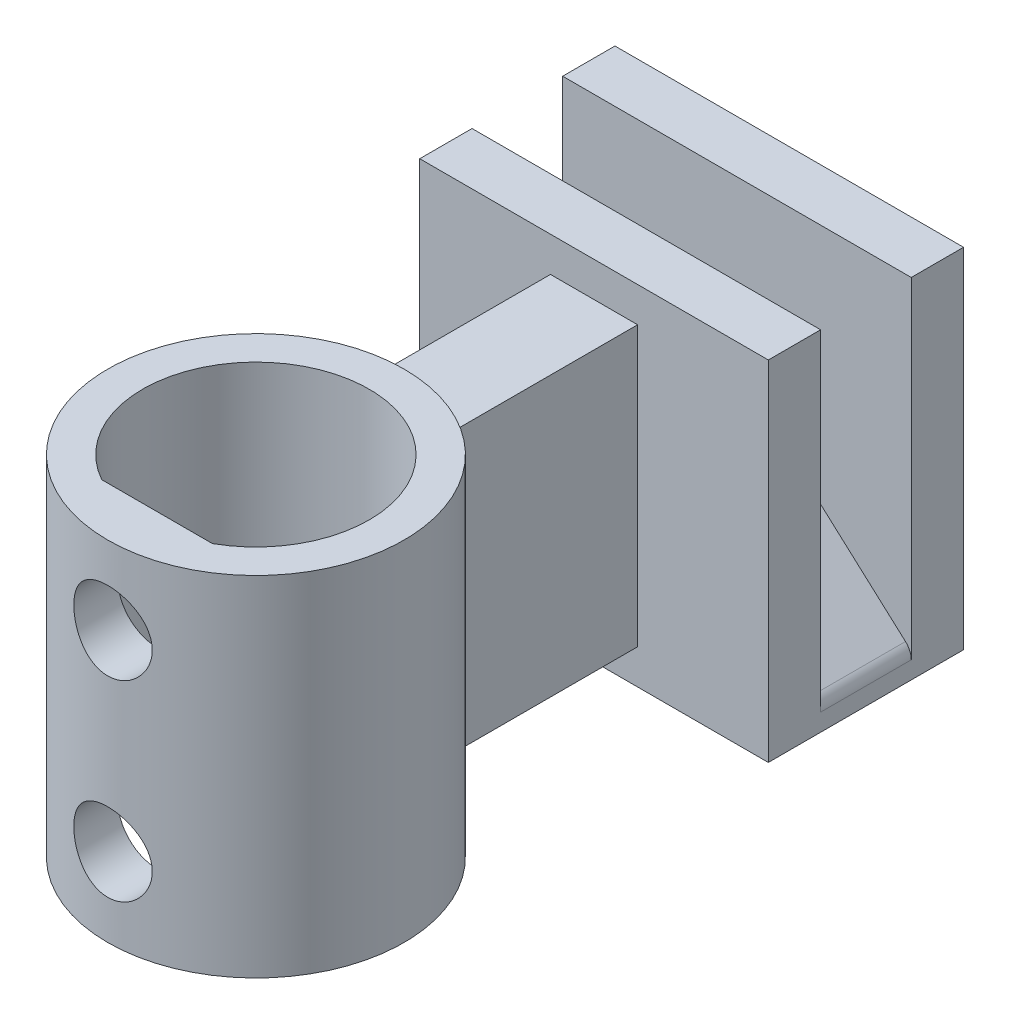
ISO-10303-21;
HEADER;
FILE_DESCRIPTION(('STEP AP214'),'2;1');
FILE_NAME('part.step','',(''),(''),'','','');
FILE_SCHEMA(('AUTOMOTIVE_DESIGN { 1 0 10303 214 1 1 1 1 }'));
ENDSEC;
DATA;
#1=APPLICATION_CONTEXT('core data for automotive mechanical design processes');
#2=APPLICATION_PROTOCOL_DEFINITION('international standard','automotive_design',2000,#1);
#3=PRODUCT_CONTEXT('',#1,'mechanical');
#4=PRODUCT('Part','Part','',(#3));
#5=PRODUCT_RELATED_PRODUCT_CATEGORY('part','',(#4));
#6=PRODUCT_DEFINITION_FORMATION('','',#4);
#7=PRODUCT_DEFINITION_CONTEXT('part definition',#1,'design');
#8=PRODUCT_DEFINITION('design','',#6,#7);
#9=PRODUCT_DEFINITION_SHAPE('','',#8);
#10=(LENGTH_UNIT() NAMED_UNIT(*) SI_UNIT(.MILLI.,.METRE.));
#11=(NAMED_UNIT(*) PLANE_ANGLE_UNIT() SI_UNIT($,.RADIAN.));
#12=(NAMED_UNIT(*) SI_UNIT($,.STERADIAN.) SOLID_ANGLE_UNIT());
#13=UNCERTAINTY_MEASURE_WITH_UNIT(LENGTH_MEASURE(1.E-05),#10,'distance_accuracy_value','');
#14=(GEOMETRIC_REPRESENTATION_CONTEXT(3) GLOBAL_UNCERTAINTY_ASSIGNED_CONTEXT((#13)) GLOBAL_UNIT_ASSIGNED_CONTEXT((#10,
#11,#12)) REPRESENTATION_CONTEXT('',''));
#15=CARTESIAN_POINT('',(0.,0.,0.));
#16=DIRECTION('',(0.,0.,1.));
#17=DIRECTION('',(1.,0.,0.));
#18=AXIS2_PLACEMENT_3D('',#15,#16,#17);
#19=CARTESIAN_POINT('',(0.,39.0416305603426,25.));
#20=DIRECTION('',(0.,-1.,0.));
#21=DIRECTION('',(0.,0.,-1.));
#22=AXIS2_PLACEMENT_3D('',#19,#20,#21);
#23=CYLINDRICAL_SURFACE('',#22,8.5);
#24=CARTESIAN_POINT('',(0.,15.,25.));
#25=DIRECTION('',(0.,-1.,0.));
#26=DIRECTION('',(0.,0.,-1.));
#27=AXIS2_PLACEMENT_3D('',#24,#25,#26);
#28=CIRCLE('',#27,8.5);
#29=CARTESIAN_POINT('',(0.,15.,16.5));
#30=VERTEX_POINT('',#29);
#31=EDGE_CURVE('E188',#30,#30,#28,.T.);
#32=ORIENTED_EDGE('',*,*,#31,.T.);
#33=EDGE_LOOP('',(#32));
#34=FACE_BOUND('',#33,.T.);
#35=CARTESIAN_POINT('',(0.,-5.,25.));
#36=DIRECTION('',(0.,1.,0.));
#37=DIRECTION('',(0.,0.,1.));
#38=AXIS2_PLACEMENT_3D('',#35,#36,#37);
#39=CIRCLE('',#38,8.5);
#40=CARTESIAN_POINT('',(0.,-5.,33.5));
#41=VERTEX_POINT('',#40);
#42=EDGE_CURVE('E194',#41,#41,#39,.F.);
#43=ORIENTED_EDGE('',*,*,#42,.F.);
#44=EDGE_LOOP('',(#43));
#45=FACE_BOUND('',#44,.T.);
#46=CARTESIAN_POINT('',(0.,-3.,25.));
#47=DIRECTION('',(0.,1.,0.));
#48=DIRECTION('',(0.,0.,1.));
#49=AXIS2_PLACEMENT_3D('',#46,#47,#48);
#50=CIRCLE('',#49,8.5);
#51=CARTESIAN_POINT('',(-2.5,-3.,16.875961595364));
#52=VERTEX_POINT('',#51);
#53=CARTESIAN_POINT('',(2.5,-3.,16.875961595364));
#54=VERTEX_POINT('',#53);
#55=EDGE_CURVE('E228',#52,#54,#50,.F.);
#56=ORIENTED_EDGE('',*,*,#55,.T.);
#57=DIRECTION('',(0.,-1.,0.));
#58=VECTOR('',#57,1.);
#59=CARTESIAN_POINT('',(2.5,39.0416305603426,16.875961595364));
#60=LINE('',#59,#58);
#61=CARTESIAN_POINT('',(2.5,13.,16.875961595364));
#62=VERTEX_POINT('',#61);
#63=EDGE_CURVE('E213',#54,#62,#60,.F.);
#64=ORIENTED_EDGE('',*,*,#63,.T.);
#65=CARTESIAN_POINT('',(0.,13.,25.));
#66=DIRECTION('',(0.,-1.,0.));
#67=DIRECTION('',(0.,0.,-1.));
#68=AXIS2_PLACEMENT_3D('',#65,#66,#67);
#69=CIRCLE('',#68,8.5);
#70=CARTESIAN_POINT('',(-2.5,13.,16.875961595364));
#71=VERTEX_POINT('',#70);
#72=EDGE_CURVE('E235',#62,#71,#69,.F.);
#73=ORIENTED_EDGE('',*,*,#72,.T.);
#74=DIRECTION('',(0.,-1.,0.));
#75=VECTOR('',#74,1.);
#76=CARTESIAN_POINT('',(-2.5,39.0416305603426,16.875961595364));
#77=LINE('',#76,#75);
#78=EDGE_CURVE('E232',#71,#52,#77,.T.);
#79=ORIENTED_EDGE('',*,*,#78,.T.);
#80=EDGE_LOOP('',(#56,#64,#73,#79));
#81=FACE_BOUND('',#80,.T.);
#82=CARTESIAN_POINT('',(-2.25,10.5,33.1967981553775));
#83=CARTESIAN_POINT('',(-2.24999694180408,10.6239840002776,33.1968003362435));
#84=CARTESIAN_POINT('',(-2.23971706610501,10.7480005412109,33.1996419584915));
#85=CARTESIAN_POINT('',(-2.198945615888,10.9924544608563,33.2106680196964));
#86=CARTESIAN_POINT('',(-2.16844370713168,11.112889976629,33.2188551904021));
#87=CARTESIAN_POINT('',(-2.0882990785985,11.3466102401079,33.2395815791112));
#88=CARTESIAN_POINT('',(-2.03868300476042,11.459904688051,33.2521147362105));
#89=CARTESIAN_POINT('',(-1.92180166354043,11.6765786826062,33.2801132198881));
#90=CARTESIAN_POINT('',(-1.85453509902009,11.7799574997535,33.2955787619447));
#91=CARTESIAN_POINT('',(-1.70248951742595,11.9764139017784,33.3281265446091));
#92=CARTESIAN_POINT('',(-1.61735395744878,12.0692109081865,33.3452371126252));
#93=CARTESIAN_POINT('',(-1.4327540142738,12.2393902103004,33.3789023677977));
#94=CARTESIAN_POINT('',(-1.33328816547564,12.3167709274061,33.3954569978831));
#95=CARTESIAN_POINT('',(-1.12090838569079,12.4550884366435,33.4264608929721));
#96=CARTESIAN_POINT('',(-1.00780712819347,12.5157466883929,33.4408728427373));
#97=CARTESIAN_POINT('',(-0.772566710508234,12.6170815196129,33.4656427357432));
#98=CARTESIAN_POINT('',(-0.650429055025734,12.6577614172222,33.4760013521304));
#99=CARTESIAN_POINT('',(-0.403511110172187,12.7170778425828,33.4912971460741));
#100=CARTESIAN_POINT('',(-0.278852839843893,12.7361915561904,33.4963515042717));
#101=CARTESIAN_POINT('',(-0.0280034780646866,12.7533339423421,33.5008788349257));
#102=CARTESIAN_POINT('',(0.0981873570184365,12.7513660941808,33.5003527283806));
#103=CARTESIAN_POINT('',(0.34519977639906,12.7267381177659,33.4938644304373));
#104=CARTESIAN_POINT('',(0.466076857336715,12.7045934898765,33.4880376721779));
#105=CARTESIAN_POINT('',(0.702334013138001,12.6410728615727,33.4717623278363));
#106=CARTESIAN_POINT('',(0.817713776487286,12.5996957727456,33.4613134801802));
#107=CARTESIAN_POINT('',(1.04102215095086,12.4984870248307,33.4367663576623));
#108=CARTESIAN_POINT('',(1.14886634833951,12.4384779194592,33.4226332115479));
#109=CARTESIAN_POINT('',(1.3531303740591,12.301844580475,33.3922415251126));
#110=CARTESIAN_POINT('',(1.44954799839656,12.2252171495074,33.375982576028));
#111=CARTESIAN_POINT('',(1.63129857081783,12.0547825542084,33.342521924539));
#112=CARTESIAN_POINT('',(1.71620777876131,11.9605256731685,33.3253065822884));
#113=CARTESIAN_POINT('',(1.86911637013184,11.7589321307718,33.2923181202052));
#114=CARTESIAN_POINT('',(1.93711475347608,11.6515946964081,33.2765450857034));
#115=CARTESIAN_POINT('',(2.05458778503724,11.4259787352489,33.2481731019722));
#116=CARTESIAN_POINT('',(2.10394886477225,11.3076384369629,33.2355937612802));
#117=CARTESIAN_POINT('',(2.18193716023719,11.0639230764637,33.2152779792318));
#118=CARTESIAN_POINT('',(2.21056943128527,10.9385497375025,33.207540357145));
#119=CARTESIAN_POINT('',(2.24556016825425,10.6882860893502,33.1980351929453));
#120=CARTESIAN_POINT('',(2.25255005779307,10.5634903897575,33.1960984643835));
#121=CARTESIAN_POINT('',(2.24579596911986,10.3145136151024,33.1979517680045));
#122=CARTESIAN_POINT('',(2.23205416085442,10.19033247708,33.2017412008412));
#123=CARTESIAN_POINT('',(2.18478304951454,9.94853203437677,33.2144565867633));
#124=CARTESIAN_POINT('',(2.15163187005439,9.83083314067768,33.2232843058655));
#125=CARTESIAN_POINT('',(2.06690749717098,9.60266578735862,33.2449859622244));
#126=CARTESIAN_POINT('',(2.0153319242454,9.49219826384843,33.2578604220901));
#127=CARTESIAN_POINT('',(1.89393612864426,9.27898360406455,33.2865532711528));
#128=CARTESIAN_POINT('',(1.82374430356199,9.17645600255329,33.3024294781708));
#129=CARTESIAN_POINT('',(1.66757023068808,8.98440278488017,33.3352002454647));
#130=CARTESIAN_POINT('',(1.58158505971235,8.89487958119961,33.3520949938724));
#131=CARTESIAN_POINT('',(1.39334723217788,8.72876291555247,33.3855805923336));
#132=CARTESIAN_POINT('',(1.29070161878611,8.65260935870141,33.4021491503459));
#133=CARTESIAN_POINT('',(1.07371678547403,8.51861464758931,33.4326221761272));
#134=CARTESIAN_POINT('',(0.959378187911347,8.46077251937521,33.4465267855714));
#135=CARTESIAN_POINT('',(0.723057226149525,8.36557056201773,33.470015772103));
#136=CARTESIAN_POINT('',(0.60113959611423,8.32805833034544,33.4796321961789));
#137=CARTESIAN_POINT('',(0.352439036803731,8.2741367860407,33.4936022569498));
#138=CARTESIAN_POINT('',(0.225657174963255,8.25772287044393,33.4979570415506));
#139=CARTESIAN_POINT('',(-0.0250604722587875,8.24674873433714,33.5008598374346));
#140=CARTESIAN_POINT('',(-0.148966409472797,8.2515427679478,33.499579436696));
#141=CARTESIAN_POINT('',(-0.394141954180563,8.28135153536109,33.4917428575153));
#142=CARTESIAN_POINT('',(-0.515411657917084,8.30636552970252,33.4851868720061));
#143=CARTESIAN_POINT('',(-0.751107699159933,8.37554121781611,33.4675689262979));
#144=CARTESIAN_POINT('',(-0.865574416324465,8.41957360028427,33.4565374265752));
#145=CARTESIAN_POINT('',(-1.08556048681217,8.5254205314973,33.4311229382255));
#146=CARTESIAN_POINT('',(-1.19107859706731,8.58723754551755,33.4167394850088));
#147=CARTESIAN_POINT('',(-1.39318530515942,8.72879850578497,33.3856885458129));
#148=CARTESIAN_POINT('',(-1.48946543719377,8.80897181418192,33.3689708718519));
#149=CARTESIAN_POINT('',(-1.66742398064291,8.98415288335479,33.3353414220771));
#150=CARTESIAN_POINT('',(-1.74909856114583,9.07916452389294,33.3184295965731));
#151=CARTESIAN_POINT('',(-1.8972708258445,9.2837921479421,33.285906991571));
#152=CARTESIAN_POINT('',(-1.96340296292341,9.39367904330234,33.2703321637851));
#153=CARTESIAN_POINT('',(-2.07615948784757,9.62341015894324,33.2427515934587));
#154=CARTESIAN_POINT('',(-2.12279681152532,9.74324771294936,33.2307434857482));
#155=CARTESIAN_POINT('',(-2.18903256232817,9.96889360228065,33.2133487458215));
#156=CARTESIAN_POINT('',(-2.21184214669942,10.0737109686333,33.2071920574266));
#157=CARTESIAN_POINT('',(-2.24232635318084,10.2856776239988,33.1989160421293));
#158=CARTESIAN_POINT('',(-2.25000264354342,10.3928266546586,33.1967962702092));
#159=CARTESIAN_POINT('',(-2.25,10.5,33.1967981553775));
#160=B_SPLINE_CURVE_WITH_KNOTS('',3,(#82,#83,#84,#85,#86,#87,#88,#89,#90,#91,#92,#93,#94,#95,
#96,#97,#98,#99,#100,#101,#102,#103,#104,#105,#106,#107,#108,#109,#110,#111,#112,#113,#114,#115,
#116,#117,#118,#119,#120,#121,#122,#123,#124,#125,#126,#127,#128,#129,#130,#131,#132,#133,#134,
#135,#136,#137,#138,#139,#140,#141,#142,#143,#144,#145,#146,#147,#148,#149,#150,#151,#152,#153,
#154,#155,#156,#157,#158,#159),.UNSPECIFIED.,.T.,.F.,(4,2,2,2,2,2,2,2,2,2,2,2,2,2,2,2,2,2,2,2,2,
2,2,2,2,2,2,2,2,2,2,2,2,2,2,2,2,2,4),(0.,0.37155797163531,0.743305970231715,1.11453760110695,
1.48579652152091,1.86532086241599,2.24488404596034,2.63043245150024,3.01591680090743,
3.39269333716487,3.76940769129443,4.13675920765004,4.50413151587257,4.87511584526133,
5.24617161521628,5.62845622010334,6.01076342740043,6.3953640456007,6.77987083621654,
7.15304843134813,7.52618696941451,7.89228731518204,8.25843495975225,8.63252754907452,
9.00668944894658,9.39148781847044,9.77626571779774,10.1581177737158,10.539886507824,
10.9101123860205,11.2803247253535,11.6480585642679,12.0158434024024,12.3933170752266,
12.7708896114263,13.156610044578,13.5420741241071,13.8632889681006,14.1844684002793),.UNSPECIFIED.);
#161=CARTESIAN_POINT('',(-2.25,10.5,33.1967981553775));
#162=VERTEX_POINT('',#161);
#163=EDGE_CURVE('E200',#162,#162,#160,.T.);
#164=ORIENTED_EDGE('',*,*,#163,.T.);
#165=EDGE_LOOP('',(#164));
#166=FACE_BOUND('',#165,.T.);
#167=CARTESIAN_POINT('',(-2.25,-0.500000000000002,33.1967981553775));
#168=CARTESIAN_POINT('',(-2.24999694180408,-0.376015999722374,33.1968003362435));
#169=CARTESIAN_POINT('',(-2.23971706610501,-0.251999458789078,33.1996419584915));
#170=CARTESIAN_POINT('',(-2.198945615888,-0.00754553914369019,33.2106680196964));
#171=CARTESIAN_POINT('',(-2.16844370713168,0.112889976628972,33.2188551904021));
#172=CARTESIAN_POINT('',(-2.0882990785985,0.346610240107896,33.2395815791112));
#173=CARTESIAN_POINT('',(-2.03868300476042,0.459904688051024,33.2521147362105));
#174=CARTESIAN_POINT('',(-1.92180166354043,0.676578682606188,33.2801132198881));
#175=CARTESIAN_POINT('',(-1.85453509902009,0.779957499753548,33.2955787619447));
#176=CARTESIAN_POINT('',(-1.70248951742595,0.976413901778359,33.3281265446091));
#177=CARTESIAN_POINT('',(-1.61735395744878,1.06921090818649,33.3452371126252));
#178=CARTESIAN_POINT('',(-1.4327540142738,1.23939021030035,33.3789023677977));
#179=CARTESIAN_POINT('',(-1.33328816547564,1.31677092740614,33.3954569978831));
#180=CARTESIAN_POINT('',(-1.12090838569079,1.45508843664353,33.426460892972));
#181=CARTESIAN_POINT('',(-1.00780712819347,1.51574668839292,33.4408728427372));
#182=CARTESIAN_POINT('',(-0.772566710508234,1.6170815196129,33.4656427357431));
#183=CARTESIAN_POINT('',(-0.650429055025735,1.65776141722221,33.4760013521304));
#184=CARTESIAN_POINT('',(-0.403511110172187,1.71707784258281,33.4912971460741));
#185=CARTESIAN_POINT('',(-0.278852839843893,1.73619155619042,33.4963515042717));
#186=CARTESIAN_POINT('',(-0.0280034780646869,1.75333394234214,33.5008788349257));
#187=CARTESIAN_POINT('',(0.0981873570184361,1.75136609418084,33.5003527283806));
#188=CARTESIAN_POINT('',(0.34519977639906,1.72673811776592,33.4938644304373));
#189=CARTESIAN_POINT('',(0.466076857336715,1.70459348987647,33.4880376721779));
#190=CARTESIAN_POINT('',(0.702334013138001,1.6410728615727,33.4717623278363));
#191=CARTESIAN_POINT('',(0.817713776487285,1.59969577274563,33.4613134801802));
#192=CARTESIAN_POINT('',(1.04102215095086,1.49848702483075,33.4367663576623));
#193=CARTESIAN_POINT('',(1.14886634833951,1.43847791945919,33.4226332115479));
#194=CARTESIAN_POINT('',(1.3531303740591,1.30184458047502,33.3922415251126));
#195=CARTESIAN_POINT('',(1.44954799839656,1.22521714950741,33.375982576028));
#196=CARTESIAN_POINT('',(1.63129857081783,1.05478255420836,33.342521924539));
#197=CARTESIAN_POINT('',(1.71620777876131,0.960525673168511,33.3253065822884));
#198=CARTESIAN_POINT('',(1.86911637013183,0.758932130771777,33.2923181202052));
#199=CARTESIAN_POINT('',(1.93711475347608,0.651594696408099,33.2765450857034));
#200=CARTESIAN_POINT('',(2.05458778503724,0.425978735248875,33.2481731019722));
#201=CARTESIAN_POINT('',(2.10394886477225,0.307638436962872,33.2355937612802));
#202=CARTESIAN_POINT('',(2.18193716023719,0.0639230764637289,33.2152779792318));
#203=CARTESIAN_POINT('',(2.21056943128527,-0.0614502624975041,33.207540357145));
#204=CARTESIAN_POINT('',(2.24556016825425,-0.311713910649751,33.1980351929453));
#205=CARTESIAN_POINT('',(2.25255005779307,-0.436509610242537,33.1960984643835));
#206=CARTESIAN_POINT('',(2.24579596911986,-0.685486384897617,33.1979517680045));
#207=CARTESIAN_POINT('',(2.23205416085442,-0.809667522920008,33.2017412008412));
#208=CARTESIAN_POINT('',(2.18478304951454,-1.05146796562323,33.2144565867633));
#209=CARTESIAN_POINT('',(2.15163187005439,-1.16916685932232,33.2232843058654));
#210=CARTESIAN_POINT('',(2.06690749717098,-1.39733421264138,33.2449859622244));
#211=CARTESIAN_POINT('',(2.0153319242454,-1.50780173615157,33.2578604220901));
#212=CARTESIAN_POINT('',(1.89393612864426,-1.72101639593545,33.2865532711528));
#213=CARTESIAN_POINT('',(1.82374430356199,-1.82354399744671,33.3024294781708));
#214=CARTESIAN_POINT('',(1.66757023068808,-2.01559721511983,33.3352002454647));
#215=CARTESIAN_POINT('',(1.58158505971235,-2.10512041880039,33.3520949938724));
#216=CARTESIAN_POINT('',(1.39334723217788,-2.27123708444753,33.3855805923336));
#217=CARTESIAN_POINT('',(1.29070161878611,-2.34739064129859,33.4021491503459));
#218=CARTESIAN_POINT('',(1.07371678547403,-2.48138535241069,33.4326221761272));
#219=CARTESIAN_POINT('',(0.959378187911347,-2.53922748062479,33.4465267855714));
#220=CARTESIAN_POINT('',(0.723057226149525,-2.63442943798227,33.470015772103));
#221=CARTESIAN_POINT('',(0.60113959611423,-2.67194166965456,33.4796321961789));
#222=CARTESIAN_POINT('',(0.352439036803731,-2.7258632139593,33.4936022569498));
#223=CARTESIAN_POINT('',(0.225657174963256,-2.74227712955607,33.4979570415506));
#224=CARTESIAN_POINT('',(-0.0250604722587871,-2.75325126566286,33.5008598374346));
#225=CARTESIAN_POINT('',(-0.148966409472797,-2.7484572320522,33.499579436696));
#226=CARTESIAN_POINT('',(-0.394141954180563,-2.71864846463891,33.4917428575153));
#227=CARTESIAN_POINT('',(-0.515411657917083,-2.69363447029748,33.4851868720061));
#228=CARTESIAN_POINT('',(-0.751107699159933,-2.62445878218389,33.4675689262979));
#229=CARTESIAN_POINT('',(-0.865574416324465,-2.58042639971573,33.4565374265752));
#230=CARTESIAN_POINT('',(-1.08556048681217,-2.4745794685027,33.4311229382255));
#231=CARTESIAN_POINT('',(-1.19107859706731,-2.41276245448245,33.4167394850088));
#232=CARTESIAN_POINT('',(-1.39318530515942,-2.27120149421503,33.3856885458129));
#233=CARTESIAN_POINT('',(-1.48946543719377,-2.19102818581808,33.3689708718519));
#234=CARTESIAN_POINT('',(-1.66742398064291,-2.01584711664521,33.3353414220771));
#235=CARTESIAN_POINT('',(-1.74909856114582,-1.92083547610706,33.3184295965731));
#236=CARTESIAN_POINT('',(-1.8972708258445,-1.7162078520579,33.285906991571));
#237=CARTESIAN_POINT('',(-1.96340296292341,-1.60632095669767,33.2703321637851));
#238=CARTESIAN_POINT('',(-2.07615948784757,-1.37658984105676,33.2427515934587));
#239=CARTESIAN_POINT('',(-2.12279681152532,-1.25675228705065,33.2307434857482));
#240=CARTESIAN_POINT('',(-2.18903256232817,-1.03110639771935,33.2133487458215));
#241=CARTESIAN_POINT('',(-2.21184214669942,-0.92628903136672,33.2071920574266));
#242=CARTESIAN_POINT('',(-2.24232635318084,-0.714322376001232,33.1989160421293));
#243=CARTESIAN_POINT('',(-2.25000264354342,-0.607173345341352,33.1967962702092));
#244=CARTESIAN_POINT('',(-2.25,-0.500000000000002,33.1967981553775));
#245=B_SPLINE_CURVE_WITH_KNOTS('',3,(#167,#168,#169,#170,#171,#172,#173,#174,#175,#176,#177,
#178,#179,#180,#181,#182,#183,#184,#185,#186,#187,#188,#189,#190,#191,#192,#193,#194,#195,#196,
#197,#198,#199,#200,#201,#202,#203,#204,#205,#206,#207,#208,#209,#210,#211,#212,#213,#214,#215,
#216,#217,#218,#219,#220,#221,#222,#223,#224,#225,#226,#227,#228,#229,#230,#231,#232,#233,#234,
#235,#236,#237,#238,#239,#240,#241,#242,#243,#244),.UNSPECIFIED.,.T.,.F.,(4,2,2,2,2,2,2,2,2,2,2,
2,2,2,2,2,2,2,2,2,2,2,2,2,2,2,2,2,2,2,2,2,2,2,2,2,2,2,4),(0.,0.371557971635309,
0.743305970231715,1.11453760110695,1.48579652152091,1.86532086241599,2.24488404596033,
2.63043245150024,3.01591680090743,3.39269333716487,3.76940769129443,4.13675920765004,
4.50413151587256,4.87511584526133,5.24617161521628,5.62845622010334,6.01076342740043,
6.3953640456007,6.77987083621654,7.15304843134812,7.5261869694145,7.89228731518204,
8.25843495975225,8.63252754907452,9.00668944894658,9.39148781847044,9.77626571779773,
10.1581177737158,10.539886507824,10.9101123860205,11.2803247253535,11.6480585642679,
12.0158434024024,12.3933170752266,12.7708896114263,13.156610044578,13.5420741241071,
13.8632889681006,14.1844684002793),.UNSPECIFIED.);
#246=CARTESIAN_POINT('',(-2.25,-0.500000000000002,33.1967981553775));
#247=VERTEX_POINT('',#246);
#248=EDGE_CURVE('E618',#247,#247,#245,.T.);
#249=ORIENTED_EDGE('',*,*,#248,.T.);
#250=EDGE_LOOP('',(#249));
#251=FACE_BOUND('',#250,.T.);
#252=ADVANCED_FACE('F37',(#34,#45,#81,#166,#251),#23,.T.);
#253=CARTESIAN_POINT('',(0.,0.,5.6));
#254=DIRECTION('',(0.,0.,1.));
#255=DIRECTION('',(1.,0.,0.));
#256=AXIS2_PLACEMENT_3D('',#253,#254,#255);
#257=PLANE('',#256);
#258=DIRECTION('',(0.,1.,0.));
#259=VECTOR('',#258,1.);
#260=CARTESIAN_POINT('',(10.,15.,5.6));
#261=LINE('',#260,#259);
#262=CARTESIAN_POINT('',(10.,-5.,5.6));
#263=VERTEX_POINT('',#262);
#264=CARTESIAN_POINT('',(10.,15.,5.6));
#265=VERTEX_POINT('',#264);
#266=EDGE_CURVE('E265',#263,#265,#261,.T.);
#267=ORIENTED_EDGE('',*,*,#266,.T.);
#268=DIRECTION('',(-1.,0.,0.));
#269=VECTOR('',#268,1.);
#270=CARTESIAN_POINT('',(-10.,15.,5.6));
#271=LINE('',#270,#269);
#272=CARTESIAN_POINT('',(-10.,15.,5.6));
#273=VERTEX_POINT('',#272);
#274=EDGE_CURVE('E268',#265,#273,#271,.T.);
#275=ORIENTED_EDGE('',*,*,#274,.T.);
#276=DIRECTION('',(0.,-1.,0.));
#277=VECTOR('',#276,1.);
#278=CARTESIAN_POINT('',(-10.,15.,5.6));
#279=LINE('',#278,#277);
#280=CARTESIAN_POINT('',(-10.,-5.,5.6));
#281=VERTEX_POINT('',#280);
#282=EDGE_CURVE('E271',#273,#281,#279,.T.);
#283=ORIENTED_EDGE('',*,*,#282,.T.);
#284=DIRECTION('',(1.,0.,0.));
#285=VECTOR('',#284,1.);
#286=CARTESIAN_POINT('',(-10.,-5.,5.6));
#287=LINE('',#286,#285);
#288=EDGE_CURVE('E274',#281,#263,#287,.T.);
#289=ORIENTED_EDGE('',*,*,#288,.T.);
#290=EDGE_LOOP('',(#267,#275,#283,#289));
#291=FACE_BOUND('',#290,.T.);
#292=DIRECTION('',(-1.,0.,0.));
#293=VECTOR('',#292,1.);
#294=CARTESIAN_POINT('',(-2.5,13.,5.6));
#295=LINE('',#294,#293);
#296=CARTESIAN_POINT('',(2.5,13.,5.6));
#297=VERTEX_POINT('',#296);
#298=CARTESIAN_POINT('',(-2.5,13.,5.6));
#299=VERTEX_POINT('',#298);
#300=EDGE_CURVE('E217',#297,#299,#295,.T.);
#301=ORIENTED_EDGE('',*,*,#300,.F.);
#302=DIRECTION('',(0.,1.,0.));
#303=VECTOR('',#302,1.);
#304=CARTESIAN_POINT('',(2.5,13.,5.6));
#305=LINE('',#304,#303);
#306=CARTESIAN_POINT('',(2.5,-3.,5.6));
#307=VERTEX_POINT('',#306);
#308=EDGE_CURVE('E221',#307,#297,#305,.T.);
#309=ORIENTED_EDGE('',*,*,#308,.F.);
#310=DIRECTION('',(1.,0.,0.));
#311=VECTOR('',#310,1.);
#312=CARTESIAN_POINT('',(-2.5,-3.,5.6));
#313=LINE('',#312,#311);
#314=CARTESIAN_POINT('',(-2.5,-3.,5.6));
#315=VERTEX_POINT('',#314);
#316=EDGE_CURVE('E210',#315,#307,#313,.T.);
#317=ORIENTED_EDGE('',*,*,#316,.F.);
#318=DIRECTION('',(0.,-1.,0.));
#319=VECTOR('',#318,1.);
#320=CARTESIAN_POINT('',(-2.5,13.,5.6));
#321=LINE('',#320,#319);
#322=EDGE_CURVE('E54',#299,#315,#321,.T.);
#323=ORIENTED_EDGE('',*,*,#322,.F.);
#324=EDGE_LOOP('',(#301,#309,#317,#323));
#325=FACE_BOUND('',#324,.T.);
#326=ADVANCED_FACE('F398',(#291,#325),#257,.T.);
#327=CARTESIAN_POINT('',(10.,-5.,2.6));
#328=DIRECTION('',(-1.,0.,0.));
#329=DIRECTION('',(0.,0.,1.));
#330=AXIS2_PLACEMENT_3D('',#327,#328,#329);
#331=PLANE('',#330);
#332=DIRECTION('',(0.,0.,-1.));
#333=VECTOR('',#332,1.);
#334=CARTESIAN_POINT('',(10.,-5.,2.6));
#335=LINE('',#334,#333);
#336=CARTESIAN_POINT('',(10.,-5.,-5.6));
#337=VERTEX_POINT('',#336);
#338=EDGE_CURVE('E292',#263,#337,#335,.T.);
#339=ORIENTED_EDGE('',*,*,#338,.T.);
#340=DIRECTION('',(0.,1.,0.));
#341=VECTOR('',#340,1.);
#342=CARTESIAN_POINT('',(10.,15.,-5.6));
#343=LINE('',#342,#341);
#344=CARTESIAN_POINT('',(10.,15.,-5.6));
#345=VERTEX_POINT('',#344);
#346=EDGE_CURVE('E240',#337,#345,#343,.T.);
#347=ORIENTED_EDGE('',*,*,#346,.T.);
#348=DIRECTION('',(0.,0.,1.));
#349=VECTOR('',#348,1.);
#350=CARTESIAN_POINT('',(10.,15.,-5.6));
#351=LINE('',#350,#349);
#352=CARTESIAN_POINT('',(10.,15.,-2.6));
#353=VERTEX_POINT('',#352);
#354=EDGE_CURVE('E253',#345,#353,#351,.T.);
#355=ORIENTED_EDGE('',*,*,#354,.T.);
#356=DIRECTION('',(0.,1.,0.));
#357=VECTOR('',#356,1.);
#358=CARTESIAN_POINT('',(10.,15.,-2.6));
#359=LINE('',#358,#357);
#360=CARTESIAN_POINT('',(10.,-3.99906710613802,-2.6));
#361=VERTEX_POINT('',#360);
#362=EDGE_CURVE('E231',#361,#353,#359,.T.);
#363=ORIENTED_EDGE('',*,*,#362,.F.);
#364=DIRECTION('',(0.,0.,-1.));
#365=VECTOR('',#364,1.);
#366=CARTESIAN_POINT('',(10.,-3.99906710613802,2.6));
#367=LINE('',#366,#365);
#368=CARTESIAN_POINT('',(10.,-3.99906710613802,2.6));
#369=VERTEX_POINT('',#368);
#370=EDGE_CURVE('E338',#361,#369,#367,.F.);
#371=ORIENTED_EDGE('',*,*,#370,.T.);
#372=DIRECTION('',(0.,1.,0.));
#373=VECTOR('',#372,1.);
#374=CARTESIAN_POINT('',(10.,15.,2.6));
#375=LINE('',#374,#373);
#376=CARTESIAN_POINT('',(10.,15.,2.6));
#377=VERTEX_POINT('',#376);
#378=EDGE_CURVE('E264',#369,#377,#375,.T.);
#379=ORIENTED_EDGE('',*,*,#378,.T.);
#380=DIRECTION('',(0.,0.,-1.));
#381=VECTOR('',#380,1.);
#382=CARTESIAN_POINT('',(10.,15.,5.6));
#383=LINE('',#382,#381);
#384=EDGE_CURVE('E285',#265,#377,#383,.T.);
#385=ORIENTED_EDGE('',*,*,#384,.F.);
#386=ORIENTED_EDGE('',*,*,#266,.F.);
#387=EDGE_LOOP('',(#339,#347,#355,#363,#371,#379,#385,#386));
#388=FACE_BOUND('',#387,.T.);
#389=ADVANCED_FACE('F376',(#388),#331,.F.);
#390=CARTESIAN_POINT('',(-10.,5.,2.6));
#391=DIRECTION('',(0.,-1.,0.));
#392=DIRECTION('',(0.,0.,-1.));
#393=AXIS2_PLACEMENT_3D('',#390,#391,#392);
#394=PLANE('',#393);
#395=DIRECTION('',(-1.,0.,0.));
#396=VECTOR('',#395,1.);
#397=CARTESIAN_POINT('',(-10.,5.,2.6));
#398=LINE('',#397,#396);
#399=CARTESIAN_POINT('',(0.116135964964551,5.,2.6));
#400=VERTEX_POINT('',#399);
#401=CARTESIAN_POINT('',(-0.116135964964546,5.,2.6));
#402=VERTEX_POINT('',#401);
#403=EDGE_CURVE('E289',#400,#402,#398,.T.);
#404=ORIENTED_EDGE('',*,*,#403,.F.);
#405=DIRECTION('',(0.,0.,1.));
#406=VECTOR('',#405,1.);
#407=CARTESIAN_POINT('',(0.116135964964551,5.,-2.6));
#408=LINE('',#407,#406);
#409=CARTESIAN_POINT('',(0.116135964964551,5.,-2.6));
#410=VERTEX_POINT('',#409);
#411=EDGE_CURVE('E11',#400,#410,#408,.F.);
#412=ORIENTED_EDGE('',*,*,#411,.T.);
#413=DIRECTION('',(-1.,0.,0.));
#414=VECTOR('',#413,1.);
#415=CARTESIAN_POINT('',(-10.,5.,-2.6));
#416=LINE('',#415,#414);
#417=CARTESIAN_POINT('',(-0.116135964964546,5.,-2.6));
#418=VERTEX_POINT('',#417);
#419=EDGE_CURVE('E288',#410,#418,#416,.T.);
#420=ORIENTED_EDGE('',*,*,#419,.T.);
#421=DIRECTION('',(0.,0.,-1.));
#422=VECTOR('',#421,1.);
#423=CARTESIAN_POINT('',(-0.116135964964546,5.,2.6));
#424=LINE('',#423,#422);
#425=EDGE_CURVE('E46',#418,#402,#424,.F.);
#426=ORIENTED_EDGE('',*,*,#425,.T.);
#427=EDGE_LOOP('',(#404,#412,#420,#426));
#428=FACE_BOUND('',#427,.T.);
#429=ADVANCED_FACE('F346',(#428),#394,.F.);
#430=CARTESIAN_POINT('',(-10.,-5.,2.6));
#431=DIRECTION('',(1.,0.,0.));
#432=DIRECTION('',(0.,0.,-1.));
#433=AXIS2_PLACEMENT_3D('',#430,#431,#432);
#434=PLANE('',#433);
#435=DIRECTION('',(0.,0.,-1.));
#436=VECTOR('',#435,1.);
#437=CARTESIAN_POINT('',(-10.,-5.,2.6));
#438=LINE('',#437,#436);
#439=CARTESIAN_POINT('',(-10.,-5.,-5.6));
#440=VERTEX_POINT('',#439);
#441=EDGE_CURVE('E295',#281,#440,#438,.T.);
#442=ORIENTED_EDGE('',*,*,#441,.F.);
#443=ORIENTED_EDGE('',*,*,#282,.F.);
#444=DIRECTION('',(0.,0.,-1.));
#445=VECTOR('',#444,1.);
#446=CARTESIAN_POINT('',(-10.,15.,5.6));
#447=LINE('',#446,#445);
#448=CARTESIAN_POINT('',(-10.,15.,2.6));
#449=VERTEX_POINT('',#448);
#450=EDGE_CURVE('E277',#273,#449,#447,.T.);
#451=ORIENTED_EDGE('',*,*,#450,.T.);
#452=DIRECTION('',(0.,-1.,0.));
#453=VECTOR('',#452,1.);
#454=CARTESIAN_POINT('',(-10.,15.,2.6));
#455=LINE('',#454,#453);
#456=CARTESIAN_POINT('',(-10.,-3.99906710613802,2.6));
#457=VERTEX_POINT('',#456);
#458=EDGE_CURVE('E269',#449,#457,#455,.T.);
#459=ORIENTED_EDGE('',*,*,#458,.T.);
#460=DIRECTION('',(0.,0.,1.));
#461=VECTOR('',#460,1.);
#462=CARTESIAN_POINT('',(-10.,-3.99906710613802,-2.6));
#463=LINE('',#462,#461);
#464=CARTESIAN_POINT('',(-10.,-3.99906710613802,-2.6));
#465=VERTEX_POINT('',#464);
#466=EDGE_CURVE('E309',#457,#465,#463,.F.);
#467=ORIENTED_EDGE('',*,*,#466,.T.);
#468=DIRECTION('',(0.,-1.,0.));
#469=VECTOR('',#468,1.);
#470=CARTESIAN_POINT('',(-10.,15.,-2.6));
#471=LINE('',#470,#469);
#472=CARTESIAN_POINT('',(-10.,15.,-2.6));
#473=VERTEX_POINT('',#472);
#474=EDGE_CURVE('E255',#473,#465,#471,.T.);
#475=ORIENTED_EDGE('',*,*,#474,.F.);
#476=DIRECTION('',(0.,0.,1.));
#477=VECTOR('',#476,1.);
#478=CARTESIAN_POINT('',(-10.,15.,-5.6));
#479=LINE('',#478,#477);
#480=CARTESIAN_POINT('',(-10.,15.,-5.6));
#481=VERTEX_POINT('',#480);
#482=EDGE_CURVE('E262',#481,#473,#479,.T.);
#483=ORIENTED_EDGE('',*,*,#482,.F.);
#484=DIRECTION('',(0.,-1.,0.));
#485=VECTOR('',#484,1.);
#486=CARTESIAN_POINT('',(-10.,15.,-5.6));
#487=LINE('',#486,#485);
#488=EDGE_CURVE('E247',#481,#440,#487,.T.);
#489=ORIENTED_EDGE('',*,*,#488,.T.);
#490=EDGE_LOOP('',(#442,#443,#451,#459,#467,#475,#483,#489));
#491=FACE_BOUND('',#490,.T.);
#492=ADVANCED_FACE('F367',(#491),#434,.F.);
#493=CARTESIAN_POINT('',(-10.,-5.,2.6));
#494=DIRECTION('',(0.,1.,0.));
#495=DIRECTION('',(0.,0.,1.));
#496=AXIS2_PLACEMENT_3D('',#493,#494,#495);
#497=PLANE('',#496);
#498=ORIENTED_EDGE('',*,*,#441,.T.);
#499=DIRECTION('',(1.,0.,0.));
#500=VECTOR('',#499,1.);
#501=CARTESIAN_POINT('',(-10.,-5.,-5.6));
#502=LINE('',#501,#500);
#503=EDGE_CURVE('E243',#440,#337,#502,.T.);
#504=ORIENTED_EDGE('',*,*,#503,.T.);
#505=ORIENTED_EDGE('',*,*,#338,.F.);
#506=ORIENTED_EDGE('',*,*,#288,.F.);
#507=EDGE_LOOP('',(#498,#504,#505,#506));
#508=FACE_BOUND('',#507,.T.);
#509=ADVANCED_FACE('F386',(#508),#497,.F.);
#510=CARTESIAN_POINT('',(0.499999999999967,5.,2.6));
#511=DIRECTION('',(-0.669130606358857,-0.743144825477396,0.));
#512=DIRECTION('',(0.,0.,-1.));
#513=AXIS2_PLACEMENT_3D('',#510,#511,#512);
#514=PLANE('',#513);
#515=DIRECTION('',(0.743144825477396,-0.669130606358857,0.));
#516=VECTOR('',#515,1.);
#517=CARTESIAN_POINT('',(0.499999999999967,5.,2.6));
#518=LINE('',#517,#516);
#519=CARTESIAN_POINT('',(9.66913060635886,-3.25592228066062,2.6));
#520=VERTEX_POINT('',#519);
#521=CARTESIAN_POINT('',(0.785266571323408,4.7431448254774,2.6));
#522=VERTEX_POINT('',#521);
#523=EDGE_CURVE('E306',#520,#522,#518,.F.);
#524=ORIENTED_EDGE('',*,*,#523,.F.);
#525=DIRECTION('',(0.,0.,1.));
#526=VECTOR('',#525,1.);
#527=CARTESIAN_POINT('',(9.66913060635886,-3.25592228066062,-2.6));
#528=LINE('',#527,#526);
#529=CARTESIAN_POINT('',(9.66913060635886,-3.25592228066062,-2.6));
#530=VERTEX_POINT('',#529);
#531=EDGE_CURVE('E343',#520,#530,#528,.F.);
#532=ORIENTED_EDGE('',*,*,#531,.T.);
#533=DIRECTION('',(-0.743144825477396,0.669130606358857,0.));
#534=VECTOR('',#533,1.);
#535=CARTESIAN_POINT('',(2.71017262260375,3.0099516320112,-2.6));
#536=LINE('',#535,#534);
#537=CARTESIAN_POINT('',(0.785266571323408,4.7431448254774,-2.6));
#538=VERTEX_POINT('',#537);
#539=EDGE_CURVE('E300',#538,#530,#536,.F.);
#540=ORIENTED_EDGE('',*,*,#539,.F.);
#541=DIRECTION('',(0.,0.,-1.));
#542=VECTOR('',#541,1.);
#543=CARTESIAN_POINT('',(0.785266571323408,4.7431448254774,2.6));
#544=LINE('',#543,#542);
#545=EDGE_CURVE('E341',#538,#522,#544,.F.);
#546=ORIENTED_EDGE('',*,*,#545,.T.);
#547=EDGE_LOOP('',(#524,#532,#540,#546));
#548=FACE_BOUND('',#547,.T.);
#549=ADVANCED_FACE('F384',(#548),#514,.F.);
#550=CARTESIAN_POINT('',(-10.,-3.55383842082948,2.6));
#551=DIRECTION('',(0.669130606358857,-0.743144825477396,0.));
#552=DIRECTION('',(0.,0.,-1.));
#553=AXIS2_PLACEMENT_3D('',#550,#551,#552);
#554=PLANE('',#553);
#555=DIRECTION('',(-0.743144825477396,-0.669130606358857,0.));
#556=VECTOR('',#555,1.);
#557=CARTESIAN_POINT('',(-2.71017262260375,3.00995163201119,-2.6));
#558=LINE('',#557,#556);
#559=CARTESIAN_POINT('',(-9.66913060635886,-3.25592228066062,-2.6));
#560=VERTEX_POINT('',#559);
#561=CARTESIAN_POINT('',(-0.785266571323402,4.7431448254774,-2.6));
#562=VERTEX_POINT('',#561);
#563=EDGE_CURVE('E297',#560,#562,#558,.F.);
#564=ORIENTED_EDGE('',*,*,#563,.F.);
#565=DIRECTION('',(0.,0.,-1.));
#566=VECTOR('',#565,1.);
#567=CARTESIAN_POINT('',(-9.66913060635886,-3.25592228066062,2.6));
#568=LINE('',#567,#566);
#569=CARTESIAN_POINT('',(-9.66913060635886,-3.25592228066062,2.6));
#570=VERTEX_POINT('',#569);
#571=EDGE_CURVE('E326',#560,#570,#568,.F.);
#572=ORIENTED_EDGE('',*,*,#571,.T.);
#573=DIRECTION('',(0.743144825477396,0.669130606358857,0.));
#574=VECTOR('',#573,1.);
#575=CARTESIAN_POINT('',(-10.,-3.55383842082948,2.6));
#576=LINE('',#575,#574);
#577=CARTESIAN_POINT('',(-0.785266571323401,4.7431448254774,2.6));
#578=VERTEX_POINT('',#577);
#579=EDGE_CURVE('E303',#578,#570,#576,.F.);
#580=ORIENTED_EDGE('',*,*,#579,.F.);
#581=DIRECTION('',(0.,0.,1.));
#582=VECTOR('',#581,1.);
#583=CARTESIAN_POINT('',(-0.785266571323403,4.7431448254774,-2.6));
#584=LINE('',#583,#582);
#585=EDGE_CURVE('E324',#578,#562,#584,.F.);
#586=ORIENTED_EDGE('',*,*,#585,.T.);
#587=EDGE_LOOP('',(#564,#572,#580,#586));
#588=FACE_BOUND('',#587,.T.);
#589=ADVANCED_FACE('F360',(#588),#554,.F.);
#590=CARTESIAN_POINT('',(-9.,-3.99906710613802,2.6));
#591=DIRECTION('',(0.,0.,-1.));
#592=DIRECTION('',(-1.,0.,0.));
#593=AXIS2_PLACEMENT_3D('',#590,#591,#592);
#594=CYLINDRICAL_SURFACE('',#593,1.);
#595=CARTESIAN_POINT('',(-9.,-3.99906710613802,2.6));
#596=DIRECTION('',(0.,0.,-1.));
#597=DIRECTION('',(-1.,0.,0.));
#598=AXIS2_PLACEMENT_3D('',#595,#596,#597);
#599=CIRCLE('',#598,1.);
#600=EDGE_CURVE('E335',#570,#457,#599,.F.);
#601=ORIENTED_EDGE('',*,*,#600,.F.);
#602=ORIENTED_EDGE('',*,*,#571,.F.);
#603=CARTESIAN_POINT('',(-9.,-3.99906710613802,-2.6));
#604=DIRECTION('',(0.,0.,-1.));
#605=DIRECTION('',(-1.,0.,0.));
#606=AXIS2_PLACEMENT_3D('',#603,#604,#605);
#607=CIRCLE('',#606,1.);
#608=EDGE_CURVE('E321',#465,#560,#607,.T.);
#609=ORIENTED_EDGE('',*,*,#608,.F.);
#610=ORIENTED_EDGE('',*,*,#466,.F.);
#611=EDGE_LOOP('',(#601,#602,#609,#610));
#612=FACE_BOUND('',#611,.T.);
#613=ADVANCED_FACE('F392',(#612),#594,.T.);
#614=CARTESIAN_POINT('',(9.00000000000001,-3.99906710613802,2.6));
#615=DIRECTION('',(0.,0.,1.));
#616=DIRECTION('',(1.,0.,0.));
#617=AXIS2_PLACEMENT_3D('',#614,#615,#616);
#618=CYLINDRICAL_SURFACE('',#617,1.);
#619=CARTESIAN_POINT('',(9.00000000000001,-3.99906710613802,-2.6));
#620=DIRECTION('',(0.,0.,-1.));
#621=DIRECTION('',(-1.,0.,0.));
#622=AXIS2_PLACEMENT_3D('',#619,#620,#621);
#623=CIRCLE('',#622,1.);
#624=EDGE_CURVE('E318',#530,#361,#623,.T.);
#625=ORIENTED_EDGE('',*,*,#624,.F.);
#626=ORIENTED_EDGE('',*,*,#531,.F.);
#627=CARTESIAN_POINT('',(9.00000000000001,-3.99906710613802,2.6));
#628=DIRECTION('',(0.,0.,-1.));
#629=DIRECTION('',(-1.,0.,0.));
#630=AXIS2_PLACEMENT_3D('',#627,#628,#629);
#631=CIRCLE('',#630,1.);
#632=EDGE_CURVE('E332',#369,#520,#631,.F.);
#633=ORIENTED_EDGE('',*,*,#632,.F.);
#634=ORIENTED_EDGE('',*,*,#370,.F.);
#635=EDGE_LOOP('',(#625,#626,#633,#634));
#636=FACE_BOUND('',#635,.T.);
#637=ADVANCED_FACE('F381',(#636),#618,.T.);
#638=CARTESIAN_POINT('',(0.116135964964551,4.,2.6));
#639=DIRECTION('',(0.,0.,-1.));
#640=DIRECTION('',(-1.,0.,0.));
#641=AXIS2_PLACEMENT_3D('',#638,#639,#640);
#642=CYLINDRICAL_SURFACE('',#641,1.);
#643=CARTESIAN_POINT('',(0.116135964964551,4.,2.6));
#644=DIRECTION('',(0.,0.,-1.));
#645=DIRECTION('',(-1.,0.,0.));
#646=AXIS2_PLACEMENT_3D('',#643,#644,#645);
#647=CIRCLE('',#646,1.);
#648=EDGE_CURVE('E329',#522,#400,#647,.F.);
#649=ORIENTED_EDGE('',*,*,#648,.F.);
#650=ORIENTED_EDGE('',*,*,#545,.F.);
#651=CARTESIAN_POINT('',(0.116135964964551,4.,-2.6));
#652=DIRECTION('',(0.,0.,-1.));
#653=DIRECTION('',(-1.,0.,0.));
#654=AXIS2_PLACEMENT_3D('',#651,#652,#653);
#655=CIRCLE('',#654,1.);
#656=EDGE_CURVE('E315',#410,#538,#655,.T.);
#657=ORIENTED_EDGE('',*,*,#656,.F.);
#658=ORIENTED_EDGE('',*,*,#411,.F.);
#659=EDGE_LOOP('',(#649,#650,#657,#658));
#660=FACE_BOUND('',#659,.T.);
#661=ADVANCED_FACE('F355',(#660),#642,.T.);
#662=CARTESIAN_POINT('',(-0.116135964964546,4.,2.6));
#663=DIRECTION('',(0.,0.,1.));
#664=DIRECTION('',(1.,0.,0.));
#665=AXIS2_PLACEMENT_3D('',#662,#663,#664);
#666=CYLINDRICAL_SURFACE('',#665,1.);
#667=CARTESIAN_POINT('',(-0.116135964964546,4.,-2.6));
#668=DIRECTION('',(0.,0.,-1.));
#669=DIRECTION('',(-1.,0.,0.));
#670=AXIS2_PLACEMENT_3D('',#667,#668,#669);
#671=CIRCLE('',#670,1.);
#672=EDGE_CURVE('E312',#562,#418,#671,.T.);
#673=ORIENTED_EDGE('',*,*,#672,.F.);
#674=ORIENTED_EDGE('',*,*,#585,.F.);
#675=CARTESIAN_POINT('',(-0.116135964964546,4.,2.6));
#676=DIRECTION('',(0.,0.,-1.));
#677=DIRECTION('',(-1.,0.,0.));
#678=AXIS2_PLACEMENT_3D('',#675,#676,#677);
#679=CIRCLE('',#678,1.);
#680=EDGE_CURVE('E62',#402,#578,#679,.F.);
#681=ORIENTED_EDGE('',*,*,#680,.F.);
#682=ORIENTED_EDGE('',*,*,#425,.F.);
#683=EDGE_LOOP('',(#673,#674,#681,#682));
#684=FACE_BOUND('',#683,.T.);
#685=ADVANCED_FACE('F39',(#684),#666,.T.);
#686=CARTESIAN_POINT('',(-10.,15.,5.6));
#687=DIRECTION('',(0.,-1.,0.));
#688=DIRECTION('',(0.,0.,-1.));
#689=AXIS2_PLACEMENT_3D('',#686,#687,#688);
#690=PLANE('',#689);
#691=DIRECTION('',(-1.,0.,0.));
#692=VECTOR('',#691,1.);
#693=CARTESIAN_POINT('',(-10.,15.,2.6));
#694=LINE('',#693,#692);
#695=EDGE_CURVE('E279',#377,#449,#694,.T.);
#696=ORIENTED_EDGE('',*,*,#695,.T.);
#697=ORIENTED_EDGE('',*,*,#450,.F.);
#698=ORIENTED_EDGE('',*,*,#274,.F.);
#699=ORIENTED_EDGE('',*,*,#384,.T.);
#700=EDGE_LOOP('',(#696,#697,#698,#699));
#701=FACE_BOUND('',#700,.T.);
#702=ADVANCED_FACE('F372',(#701),#690,.F.);
#703=CARTESIAN_POINT('',(0.,0.,2.6));
#704=DIRECTION('',(0.,0.,1.));
#705=DIRECTION('',(1.,0.,0.));
#706=AXIS2_PLACEMENT_3D('',#703,#704,#705);
#707=PLANE('',#706);
#708=ORIENTED_EDGE('',*,*,#579,.T.);
#709=ORIENTED_EDGE('',*,*,#600,.T.);
#710=ORIENTED_EDGE('',*,*,#458,.F.);
#711=ORIENTED_EDGE('',*,*,#695,.F.);
#712=ORIENTED_EDGE('',*,*,#378,.F.);
#713=ORIENTED_EDGE('',*,*,#632,.T.);
#714=ORIENTED_EDGE('',*,*,#523,.T.);
#715=ORIENTED_EDGE('',*,*,#648,.T.);
#716=ORIENTED_EDGE('',*,*,#403,.T.);
#717=ORIENTED_EDGE('',*,*,#680,.T.);
#718=EDGE_LOOP('',(#708,#709,#710,#711,#712,#713,#714,#715,#716,#717));
#719=FACE_BOUND('',#718,.T.);
#720=ADVANCED_FACE('F351',(#719),#707,.F.);
#721=CARTESIAN_POINT('',(-10.,15.,-5.6));
#722=DIRECTION('',(0.,1.,0.));
#723=DIRECTION('',(0.,0.,1.));
#724=AXIS2_PLACEMENT_3D('',#721,#722,#723);
#725=PLANE('',#724);
#726=DIRECTION('',(-1.,0.,0.));
#727=VECTOR('',#726,1.);
#728=CARTESIAN_POINT('',(-10.,15.,-2.6));
#729=LINE('',#728,#727);
#730=EDGE_CURVE('E244',#353,#473,#729,.T.);
#731=ORIENTED_EDGE('',*,*,#730,.F.);
#732=ORIENTED_EDGE('',*,*,#354,.F.);
#733=DIRECTION('',(-1.,0.,0.));
#734=VECTOR('',#733,1.);
#735=CARTESIAN_POINT('',(-10.,15.,-5.6));
#736=LINE('',#735,#734);
#737=EDGE_CURVE('E250',#345,#481,#736,.T.);
#738=ORIENTED_EDGE('',*,*,#737,.T.);
#739=ORIENTED_EDGE('',*,*,#482,.T.);
#740=EDGE_LOOP('',(#731,#732,#738,#739));
#741=FACE_BOUND('',#740,.T.);
#742=ADVANCED_FACE('F437',(#741),#725,.T.);
#743=CARTESIAN_POINT('',(0.,0.,-5.6));
#744=DIRECTION('',(0.,0.,-1.));
#745=DIRECTION('',(1.,0.,0.));
#746=AXIS2_PLACEMENT_3D('',#743,#744,#745);
#747=PLANE('',#746);
#748=ORIENTED_EDGE('',*,*,#346,.F.);
#749=ORIENTED_EDGE('',*,*,#503,.F.);
#750=ORIENTED_EDGE('',*,*,#488,.F.);
#751=ORIENTED_EDGE('',*,*,#737,.F.);
#752=EDGE_LOOP('',(#748,#749,#750,#751));
#753=FACE_BOUND('',#752,.T.);
#754=ADVANCED_FACE('F434',(#753),#747,.T.);
#755=CARTESIAN_POINT('',(0.,0.,-2.6));
#756=DIRECTION('',(0.,0.,-1.));
#757=DIRECTION('',(1.,0.,0.));
#758=AXIS2_PLACEMENT_3D('',#755,#756,#757);
#759=PLANE('',#758);
#760=ORIENTED_EDGE('',*,*,#474,.T.);
#761=ORIENTED_EDGE('',*,*,#608,.T.);
#762=ORIENTED_EDGE('',*,*,#563,.T.);
#763=ORIENTED_EDGE('',*,*,#672,.T.);
#764=ORIENTED_EDGE('',*,*,#419,.F.);
#765=ORIENTED_EDGE('',*,*,#656,.T.);
#766=ORIENTED_EDGE('',*,*,#539,.T.);
#767=ORIENTED_EDGE('',*,*,#624,.T.);
#768=ORIENTED_EDGE('',*,*,#362,.T.);
#769=ORIENTED_EDGE('',*,*,#730,.T.);
#770=EDGE_LOOP('',(#760,#761,#762,#763,#764,#765,#766,#767,#768,#769));
#771=FACE_BOUND('',#770,.T.);
#772=ADVANCED_FACE('F357',(#771),#759,.F.);
#773=CARTESIAN_POINT('',(2.5,13.,33.501));
#774=DIRECTION('',(-1.,0.,0.));
#775=DIRECTION('',(0.,-1.,0.));
#776=AXIS2_PLACEMENT_3D('',#773,#774,#775);
#777=PLANE('',#776);
#778=ORIENTED_EDGE('',*,*,#63,.F.);
#779=DIRECTION('',(0.,0.,-1.));
#780=VECTOR('',#779,1.);
#781=CARTESIAN_POINT('',(2.5,-3.,33.501));
#782=LINE('',#781,#780);
#783=EDGE_CURVE('E206',#54,#307,#782,.T.);
#784=ORIENTED_EDGE('',*,*,#783,.T.);
#785=ORIENTED_EDGE('',*,*,#308,.T.);
#786=DIRECTION('',(0.,0.,-1.));
#787=VECTOR('',#786,1.);
#788=CARTESIAN_POINT('',(2.5,13.,33.501));
#789=LINE('',#788,#787);
#790=EDGE_CURVE('E220',#62,#297,#789,.T.);
#791=ORIENTED_EDGE('',*,*,#790,.F.);
#792=EDGE_LOOP('',(#778,#784,#785,#791));
#793=FACE_BOUND('',#792,.T.);
#794=ADVANCED_FACE('F420',(#793),#777,.F.);
#795=CARTESIAN_POINT('',(-2.5,13.,33.501));
#796=DIRECTION('',(0.,-1.,0.));
#797=DIRECTION('',(0.,0.,-1.));
#798=AXIS2_PLACEMENT_3D('',#795,#796,#797);
#799=PLANE('',#798);
#800=ORIENTED_EDGE('',*,*,#72,.F.);
#801=ORIENTED_EDGE('',*,*,#790,.T.);
#802=ORIENTED_EDGE('',*,*,#300,.T.);
#803=DIRECTION('',(0.,0.,-1.));
#804=VECTOR('',#803,1.);
#805=CARTESIAN_POINT('',(-2.5,13.,33.501));
#806=LINE('',#805,#804);
#807=EDGE_CURVE('E216',#71,#299,#806,.T.);
#808=ORIENTED_EDGE('',*,*,#807,.F.);
#809=EDGE_LOOP('',(#800,#801,#802,#808));
#810=FACE_BOUND('',#809,.T.);
#811=ADVANCED_FACE('F423',(#810),#799,.F.);
#812=CARTESIAN_POINT('',(-2.5,13.,33.501));
#813=DIRECTION('',(1.,0.,0.));
#814=DIRECTION('',(0.,1.,0.));
#815=AXIS2_PLACEMENT_3D('',#812,#813,#814);
#816=PLANE('',#815);
#817=ORIENTED_EDGE('',*,*,#78,.F.);
#818=ORIENTED_EDGE('',*,*,#807,.T.);
#819=ORIENTED_EDGE('',*,*,#322,.T.);
#820=DIRECTION('',(0.,0.,-1.));
#821=VECTOR('',#820,1.);
#822=CARTESIAN_POINT('',(-2.5,-3.,33.501));
#823=LINE('',#822,#821);
#824=EDGE_CURVE('E214',#52,#315,#823,.T.);
#825=ORIENTED_EDGE('',*,*,#824,.F.);
#826=EDGE_LOOP('',(#817,#818,#819,#825));
#827=FACE_BOUND('',#826,.T.);
#828=ADVANCED_FACE('F427',(#827),#816,.F.);
#829=CARTESIAN_POINT('',(-2.5,-3.,33.501));
#830=DIRECTION('',(0.,1.,0.));
#831=DIRECTION('',(0.,0.,1.));
#832=AXIS2_PLACEMENT_3D('',#829,#830,#831);
#833=PLANE('',#832);
#834=ORIENTED_EDGE('',*,*,#55,.F.);
#835=ORIENTED_EDGE('',*,*,#824,.T.);
#836=ORIENTED_EDGE('',*,*,#316,.T.);
#837=ORIENTED_EDGE('',*,*,#783,.F.);
#838=EDGE_LOOP('',(#834,#835,#836,#837));
#839=FACE_BOUND('',#838,.T.);
#840=ADVANCED_FACE('F416',(#839),#833,.F.);
#841=CARTESIAN_POINT('',(0.,39.0416305603426,25.));
#842=DIRECTION('',(0.,-1.,0.));
#843=DIRECTION('',(0.,0.,-1.));
#844=AXIS2_PLACEMENT_3D('',#841,#842,#843);
#845=CYLINDRICAL_SURFACE('',#844,6.5);
#846=CARTESIAN_POINT('',(0.,15.,25.));
#847=DIRECTION('',(0.,-1.,0.));
#848=DIRECTION('',(0.,0.,-1.));
#849=AXIS2_PLACEMENT_3D('',#846,#847,#848);
#850=CIRCLE('',#849,6.5);
#851=CARTESIAN_POINT('',(-3.175,15.,30.6718052681664));
#852=VERTEX_POINT('',#851);
#853=CARTESIAN_POINT('',(3.175,15.,30.6718052681664));
#854=VERTEX_POINT('',#853);
#855=EDGE_CURVE('E183',#852,#854,#850,.T.);
#856=ORIENTED_EDGE('',*,*,#855,.F.);
#857=DIRECTION('',(0.,-1.,0.));
#858=VECTOR('',#857,1.);
#859=CARTESIAN_POINT('',(-3.175,39.0416305603426,30.6718052681664));
#860=LINE('',#859,#858);
#861=CARTESIAN_POINT('',(-3.175,-5.,30.6718052681664));
#862=VERTEX_POINT('',#861);
#863=EDGE_CURVE('E178',#852,#862,#860,.T.);
#864=ORIENTED_EDGE('',*,*,#863,.T.);
#865=CARTESIAN_POINT('',(0.,-5.,25.));
#866=DIRECTION('',(0.,1.,0.));
#867=DIRECTION('',(0.,0.,1.));
#868=AXIS2_PLACEMENT_3D('',#865,#866,#867);
#869=CIRCLE('',#868,6.5);
#870=CARTESIAN_POINT('',(3.175,-5.,30.6718052681664));
#871=VERTEX_POINT('',#870);
#872=EDGE_CURVE('E182',#862,#871,#869,.F.);
#873=ORIENTED_EDGE('',*,*,#872,.T.);
#874=DIRECTION('',(0.,-1.,0.));
#875=VECTOR('',#874,1.);
#876=CARTESIAN_POINT('',(3.175,39.0416305603426,30.6718052681664));
#877=LINE('',#876,#875);
#878=EDGE_CURVE('E187',#854,#871,#877,.T.);
#879=ORIENTED_EDGE('',*,*,#878,.F.);
#880=EDGE_LOOP('',(#856,#864,#873,#879));
#881=FACE_BOUND('',#880,.T.);
#882=ADVANCED_FACE('F180',(#881),#845,.F.);
#883=CARTESIAN_POINT('',(3.175,39.0416305603426,30.6718052681664));
#884=DIRECTION('',(0.,0.,-1.));
#885=DIRECTION('',(-1.,0.,0.));
#886=AXIS2_PLACEMENT_3D('',#883,#884,#885);
#887=PLANE('',#886);
#888=CARTESIAN_POINT('',(0.,-0.500000000000002,30.6718052681664));
#889=DIRECTION('',(0.,0.,-1.));
#890=DIRECTION('',(-1.,0.,0.));
#891=AXIS2_PLACEMENT_3D('',#888,#889,#890);
#892=CIRCLE('',#891,2.25);
#893=CARTESIAN_POINT('',(-2.25,-0.500000000000002,30.6718052681664));
#894=VERTEX_POINT('',#893);
#895=EDGE_CURVE('E41',#894,#894,#892,.F.);
#896=ORIENTED_EDGE('',*,*,#895,.T.);
#897=EDGE_LOOP('',(#896));
#898=FACE_BOUND('',#897,.T.);
#899=CARTESIAN_POINT('',(0.,10.5,30.6718052681664));
#900=DIRECTION('',(0.,0.,-1.));
#901=DIRECTION('',(-1.,0.,0.));
#902=AXIS2_PLACEMENT_3D('',#899,#900,#901);
#903=CIRCLE('',#902,2.25);
#904=CARTESIAN_POINT('',(-2.25,10.5,30.6718052681664));
#905=VERTEX_POINT('',#904);
#906=EDGE_CURVE('E197',#905,#905,#903,.F.);
#907=ORIENTED_EDGE('',*,*,#906,.T.);
#908=EDGE_LOOP('',(#907));
#909=FACE_BOUND('',#908,.T.);
#910=DIRECTION('',(-1.,0.,0.));
#911=VECTOR('',#910,1.);
#912=CARTESIAN_POINT('',(3.175,15.,30.6718052681664));
#913=LINE('',#912,#911);
#914=EDGE_CURVE('E205',#854,#852,#913,.T.);
#915=ORIENTED_EDGE('',*,*,#914,.F.);
#916=ORIENTED_EDGE('',*,*,#878,.T.);
#917=DIRECTION('',(-1.,0.,0.));
#918=VECTOR('',#917,1.);
#919=CARTESIAN_POINT('',(3.175,-5.,30.6718052681664));
#920=LINE('',#919,#918);
#921=EDGE_CURVE('E193',#871,#862,#920,.T.);
#922=ORIENTED_EDGE('',*,*,#921,.T.);
#923=ORIENTED_EDGE('',*,*,#863,.F.);
#924=EDGE_LOOP('',(#915,#916,#922,#923));
#925=FACE_BOUND('',#924,.T.);
#926=ADVANCED_FACE('F196',(#898,#909,#925),#887,.T.);
#927=CARTESIAN_POINT('',(-10.,15.,5.6));
#928=DIRECTION('',(0.,-1.,0.));
#929=DIRECTION('',(0.,0.,-1.));
#930=AXIS2_PLACEMENT_3D('',#927,#928,#929);
#931=PLANE('',#930);
#932=ORIENTED_EDGE('',*,*,#855,.T.);
#933=ORIENTED_EDGE('',*,*,#914,.T.);
#934=EDGE_LOOP('',(#932,#933));
#935=FACE_BOUND('',#934,.T.);
#936=ORIENTED_EDGE('',*,*,#31,.F.);
#937=EDGE_LOOP('',(#936));
#938=FACE_BOUND('',#937,.T.);
#939=ADVANCED_FACE('F412',(#935,#938),#931,.F.);
#940=CARTESIAN_POINT('',(-10.,-5.,2.6));
#941=DIRECTION('',(0.,1.,0.));
#942=DIRECTION('',(0.,0.,1.));
#943=AXIS2_PLACEMENT_3D('',#940,#941,#942);
#944=PLANE('',#943);
#945=ORIENTED_EDGE('',*,*,#42,.T.);
#946=EDGE_LOOP('',(#945));
#947=FACE_BOUND('',#946,.T.);
#948=ORIENTED_EDGE('',*,*,#921,.F.);
#949=ORIENTED_EDGE('',*,*,#872,.F.);
#950=EDGE_LOOP('',(#948,#949));
#951=FACE_BOUND('',#950,.T.);
#952=ADVANCED_FACE('F192',(#947,#951),#944,.F.);
#953=CARTESIAN_POINT('',(0.,10.5,33.501));
#954=DIRECTION('',(0.,0.,-1.));
#955=DIRECTION('',(-1.,0.,0.));
#956=AXIS2_PLACEMENT_3D('',#953,#954,#955);
#957=CYLINDRICAL_SURFACE('',#956,2.25);
#958=ORIENTED_EDGE('',*,*,#906,.F.);
#959=EDGE_LOOP('',(#958));
#960=FACE_BOUND('',#959,.T.);
#961=ORIENTED_EDGE('',*,*,#163,.F.);
#962=EDGE_LOOP('',(#961));
#963=FACE_BOUND('',#962,.T.);
#964=ADVANCED_FACE('F580',(#960,#963),#957,.F.);
#965=CARTESIAN_POINT('',(0.,-0.500000000000002,33.501));
#966=DIRECTION('',(0.,0.,-1.));
#967=DIRECTION('',(-1.,0.,0.));
#968=AXIS2_PLACEMENT_3D('',#965,#966,#967);
#969=CYLINDRICAL_SURFACE('',#968,2.25);
#970=ORIENTED_EDGE('',*,*,#895,.F.);
#971=EDGE_LOOP('',(#970));
#972=FACE_BOUND('',#971,.T.);
#973=ORIENTED_EDGE('',*,*,#248,.F.);
#974=EDGE_LOOP('',(#973));
#975=FACE_BOUND('',#974,.T.);
#976=ADVANCED_FACE('F598',(#972,#975),#969,.F.);
#977=CLOSED_SHELL('',(#252,#326,#389,#429,#492,#509,#549,#589,#613,#637,#661,#685,#702,#720,
#742,#754,#772,#794,#811,#828,#840,#882,#926,#939,#952,#964,#976));
#978=MANIFOLD_SOLID_BREP('B2',#977);
#979=ADVANCED_BREP_SHAPE_REPRESENTATION('',(#18,#978),#14);
#980=SHAPE_DEFINITION_REPRESENTATION(#9,#979);
ENDSEC;
END-ISO-10303-21;
